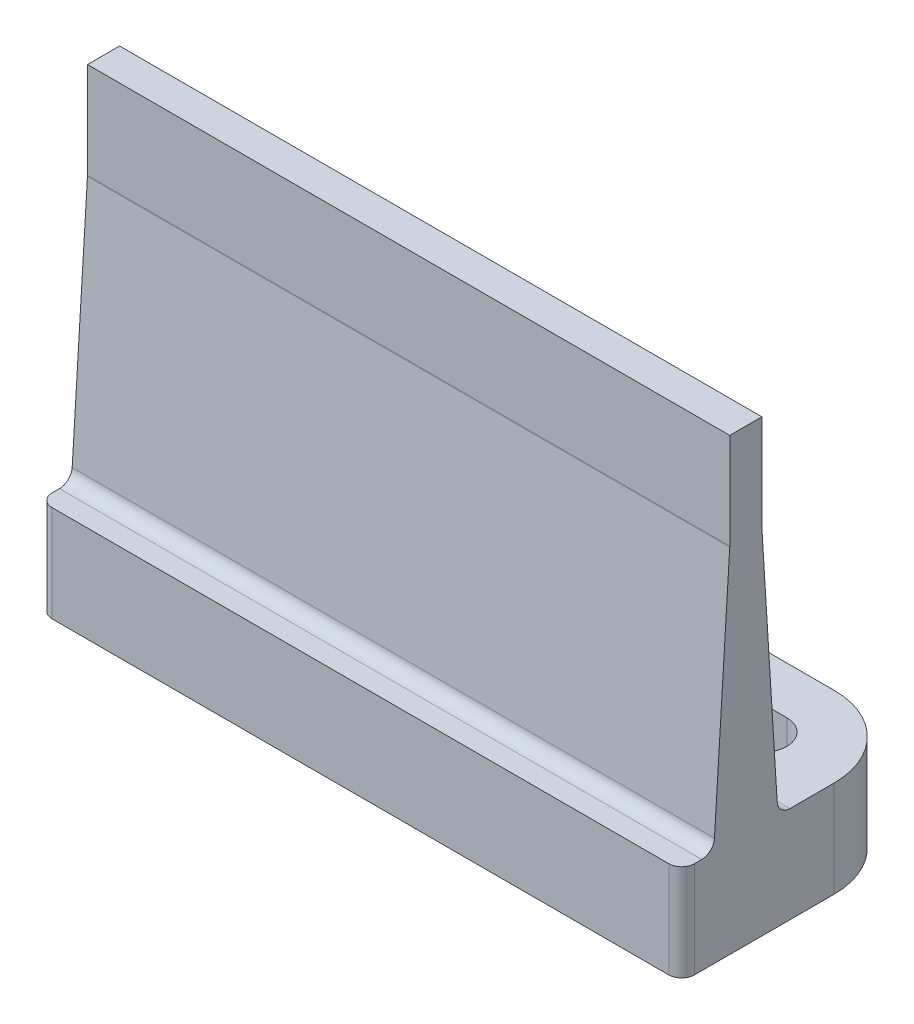
ISO-10303-21;
HEADER;
FILE_DESCRIPTION(('STEP AP214'),'2;1');
FILE_NAME('part.step','',(''),(''),'','','');
FILE_SCHEMA(('AUTOMOTIVE_DESIGN { 1 0 10303 214 1 1 1 1 }'));
ENDSEC;
DATA;
#1=APPLICATION_CONTEXT('core data for automotive mechanical design processes');
#2=APPLICATION_PROTOCOL_DEFINITION('international standard','automotive_design',2000,#1);
#3=PRODUCT_CONTEXT('',#1,'mechanical');
#4=PRODUCT('Part','Part','',(#3));
#5=PRODUCT_RELATED_PRODUCT_CATEGORY('part','',(#4));
#6=PRODUCT_DEFINITION_FORMATION('','',#4);
#7=PRODUCT_DEFINITION_CONTEXT('part definition',#1,'design');
#8=PRODUCT_DEFINITION('design','',#6,#7);
#9=PRODUCT_DEFINITION_SHAPE('','',#8);
#10=(LENGTH_UNIT() NAMED_UNIT(*) SI_UNIT(.MILLI.,.METRE.));
#11=(NAMED_UNIT(*) PLANE_ANGLE_UNIT() SI_UNIT($,.RADIAN.));
#12=(NAMED_UNIT(*) SI_UNIT($,.STERADIAN.) SOLID_ANGLE_UNIT());
#13=UNCERTAINTY_MEASURE_WITH_UNIT(LENGTH_MEASURE(1.E-05),#10,'distance_accuracy_value','');
#14=(GEOMETRIC_REPRESENTATION_CONTEXT(3) GLOBAL_UNCERTAINTY_ASSIGNED_CONTEXT((#13)) GLOBAL_UNIT_ASSIGNED_CONTEXT((#10,
#11,#12)) REPRESENTATION_CONTEXT('',''));
#15=CARTESIAN_POINT('',(0.,0.,0.));
#16=DIRECTION('',(0.,0.,1.));
#17=DIRECTION('',(1.,0.,0.));
#18=AXIS2_PLACEMENT_3D('',#15,#16,#17);
#19=CARTESIAN_POINT('',(20.,6.,4.));
#20=DIRECTION('',(0.,0.,-1.));
#21=DIRECTION('',(0.,1.,0.));
#22=AXIS2_PLACEMENT_3D('',#19,#20,#21);
#23=PLANE('',#22);
#24=DIRECTION('',(-1.,0.,0.));
#25=VECTOR('',#24,1.);
#26=CARTESIAN_POINT('',(20.,0.,4.));
#27=LINE('',#26,#25);
#28=CARTESIAN_POINT('',(19.20625,0.,4.));
#29=VERTEX_POINT('',#28);
#30=CARTESIAN_POINT('',(-19.20625,0.,4.));
#31=VERTEX_POINT('',#30);
#32=EDGE_CURVE('E443',#29,#31,#27,.T.);
#33=ORIENTED_EDGE('',*,*,#32,.F.);
#34=DIRECTION('',(0.,-1.,0.));
#35=VECTOR('',#34,1.);
#36=CARTESIAN_POINT('',(19.20625,6.,4.));
#37=LINE('',#36,#35);
#38=CARTESIAN_POINT('',(19.20625,6.,4.));
#39=VERTEX_POINT('',#38);
#40=EDGE_CURVE('E519',#29,#39,#37,.F.);
#41=ORIENTED_EDGE('',*,*,#40,.T.);
#42=DIRECTION('',(-1.,0.,0.));
#43=VECTOR('',#42,1.);
#44=CARTESIAN_POINT('',(20.,6.,4.));
#45=LINE('',#44,#43);
#46=CARTESIAN_POINT('',(-19.20625,6.,4.));
#47=VERTEX_POINT('',#46);
#48=EDGE_CURVE('E396',#39,#47,#45,.T.);
#49=ORIENTED_EDGE('',*,*,#48,.T.);
#50=DIRECTION('',(0.,-1.,0.));
#51=VECTOR('',#50,1.);
#52=CARTESIAN_POINT('',(-19.20625,6.,4.));
#53=LINE('',#52,#51);
#54=EDGE_CURVE('E516',#47,#31,#53,.T.);
#55=ORIENTED_EDGE('',*,*,#54,.T.);
#56=EDGE_LOOP('',(#33,#41,#49,#55));
#57=FACE_BOUND('',#56,.T.);
#58=ADVANCED_FACE('F42',(#57),#23,.F.);
#59=CARTESIAN_POINT('',(20.,0.,4.));
#60=DIRECTION('',(0.,1.,0.));
#61=DIRECTION('',(0.,0.,1.));
#62=AXIS2_PLACEMENT_3D('',#59,#60,#61);
#63=PLANE('',#62);
#64=DIRECTION('',(1.,0.,0.));
#65=VECTOR('',#64,1.);
#66=CARTESIAN_POINT('',(-15.,0.,-7.55));
#67=LINE('',#66,#65);
#68=CARTESIAN_POINT('',(-15.,0.,-7.55));
#69=VERTEX_POINT('',#68);
#70=CARTESIAN_POINT('',(-5.,0.,-7.55));
#71=VERTEX_POINT('',#70);
#72=EDGE_CURVE('E295',#69,#71,#67,.T.);
#73=ORIENTED_EDGE('',*,*,#72,.F.);
#74=CARTESIAN_POINT('',(-15.,0.,-6.));
#75=DIRECTION('',(0.,1.,0.));
#76=DIRECTION('',(0.,0.,1.));
#77=AXIS2_PLACEMENT_3D('',#74,#75,#76);
#78=CIRCLE('',#77,1.55);
#79=CARTESIAN_POINT('',(-15.,0.,-4.45));
#80=VERTEX_POINT('',#79);
#81=EDGE_CURVE('E271',#80,#69,#78,.F.);
#82=ORIENTED_EDGE('',*,*,#81,.F.);
#83=DIRECTION('',(-1.,0.,0.));
#84=VECTOR('',#83,1.);
#85=CARTESIAN_POINT('',(-15.,0.,-4.45));
#86=LINE('',#85,#84);
#87=CARTESIAN_POINT('',(-5.,0.,-4.45));
#88=VERTEX_POINT('',#87);
#89=EDGE_CURVE('E284',#88,#80,#86,.T.);
#90=ORIENTED_EDGE('',*,*,#89,.F.);
#91=CARTESIAN_POINT('',(-5.,0.,-6.));
#92=DIRECTION('',(0.,1.,0.));
#93=DIRECTION('',(0.,0.,1.));
#94=AXIS2_PLACEMENT_3D('',#91,#92,#93);
#95=CIRCLE('',#94,1.55);
#96=EDGE_CURVE('E303',#71,#88,#95,.F.);
#97=ORIENTED_EDGE('',*,*,#96,.F.);
#98=EDGE_LOOP('',(#73,#82,#90,#97));
#99=FACE_BOUND('',#98,.T.);
#100=DIRECTION('',(1.,0.,0.));
#101=VECTOR('',#100,1.);
#102=CARTESIAN_POINT('',(5.,0.,-7.55));
#103=LINE('',#102,#101);
#104=CARTESIAN_POINT('',(5.,0.,-7.55));
#105=VERTEX_POINT('',#104);
#106=CARTESIAN_POINT('',(15.,0.,-7.55));
#107=VERTEX_POINT('',#106);
#108=EDGE_CURVE('E326',#105,#107,#103,.T.);
#109=ORIENTED_EDGE('',*,*,#108,.F.);
#110=CARTESIAN_POINT('',(5.,0.,-6.));
#111=DIRECTION('',(0.,1.,0.));
#112=DIRECTION('',(0.,0.,1.));
#113=AXIS2_PLACEMENT_3D('',#110,#111,#112);
#114=CIRCLE('',#113,1.55);
#115=CARTESIAN_POINT('',(5.,0.,-4.45));
#116=VERTEX_POINT('',#115);
#117=EDGE_CURVE('E330',#116,#105,#114,.F.);
#118=ORIENTED_EDGE('',*,*,#117,.F.);
#119=DIRECTION('',(-1.,0.,0.));
#120=VECTOR('',#119,1.);
#121=CARTESIAN_POINT('',(5.,0.,-4.45));
#122=LINE('',#121,#120);
#123=CARTESIAN_POINT('',(15.,0.,-4.45));
#124=VERTEX_POINT('',#123);
#125=EDGE_CURVE('E353',#124,#116,#122,.T.);
#126=ORIENTED_EDGE('',*,*,#125,.F.);
#127=CARTESIAN_POINT('',(15.,0.,-6.));
#128=DIRECTION('',(0.,1.,0.));
#129=DIRECTION('',(0.,0.,1.));
#130=AXIS2_PLACEMENT_3D('',#127,#128,#129);
#131=CIRCLE('',#130,1.55);
#132=EDGE_CURVE('E323',#107,#124,#131,.F.);
#133=ORIENTED_EDGE('',*,*,#132,.F.);
#134=EDGE_LOOP('',(#109,#118,#126,#133));
#135=FACE_BOUND('',#134,.T.);
#136=DIRECTION('',(0.,0.,-1.));
#137=VECTOR('',#136,1.);
#138=CARTESIAN_POINT('',(20.,0.,4.));
#139=LINE('',#138,#137);
#140=CARTESIAN_POINT('',(20.,0.,3.20625));
#141=VERTEX_POINT('',#140);
#142=CARTESIAN_POINT('',(20.,0.,-5.5));
#143=VERTEX_POINT('',#142);
#144=EDGE_CURVE('E366',#141,#143,#139,.T.);
#145=ORIENTED_EDGE('',*,*,#144,.F.);
#146=CARTESIAN_POINT('',(19.20625,0.,3.20625));
#147=DIRECTION('',(0.,1.,0.));
#148=DIRECTION('',(0.,0.,1.));
#149=AXIS2_PLACEMENT_3D('',#146,#147,#148);
#150=CIRCLE('',#149,0.79375);
#151=EDGE_CURVE('E513',#141,#29,#150,.F.);
#152=ORIENTED_EDGE('',*,*,#151,.T.);
#153=ORIENTED_EDGE('',*,*,#32,.T.);
#154=CARTESIAN_POINT('',(-19.20625,0.,3.20625));
#155=DIRECTION('',(0.,1.,0.));
#156=DIRECTION('',(0.,0.,1.));
#157=AXIS2_PLACEMENT_3D('',#154,#155,#156);
#158=CIRCLE('',#157,0.79375);
#159=CARTESIAN_POINT('',(-20.,0.,3.20625));
#160=VERTEX_POINT('',#159);
#161=EDGE_CURVE('E61',#31,#160,#158,.F.);
#162=ORIENTED_EDGE('',*,*,#161,.T.);
#163=DIRECTION('',(0.,0.,-1.));
#164=VECTOR('',#163,1.);
#165=CARTESIAN_POINT('',(-20.,0.,4.));
#166=LINE('',#165,#164);
#167=CARTESIAN_POINT('',(-20.,0.,-5.5));
#168=VERTEX_POINT('',#167);
#169=EDGE_CURVE('E289',#160,#168,#166,.T.);
#170=ORIENTED_EDGE('',*,*,#169,.T.);
#171=CARTESIAN_POINT('',(-15.,0.,-5.5));
#172=DIRECTION('',(0.,1.,0.));
#173=DIRECTION('',(0.,0.,1.));
#174=AXIS2_PLACEMENT_3D('',#171,#172,#173);
#175=CIRCLE('',#174,5.);
#176=CARTESIAN_POINT('',(-15.,0.,-10.5));
#177=VERTEX_POINT('',#176);
#178=EDGE_CURVE('E463',#168,#177,#175,.F.);
#179=ORIENTED_EDGE('',*,*,#178,.T.);
#180=DIRECTION('',(-1.,0.,0.));
#181=VECTOR('',#180,1.);
#182=CARTESIAN_POINT('',(20.,0.,-10.5));
#183=LINE('',#182,#181);
#184=CARTESIAN_POINT('',(15.,0.,-10.5));
#185=VERTEX_POINT('',#184);
#186=EDGE_CURVE('E439',#185,#177,#183,.T.);
#187=ORIENTED_EDGE('',*,*,#186,.F.);
#188=CARTESIAN_POINT('',(15.,0.,-5.5));
#189=DIRECTION('',(0.,1.,0.));
#190=DIRECTION('',(0.,0.,1.));
#191=AXIS2_PLACEMENT_3D('',#188,#189,#190);
#192=CIRCLE('',#191,5.);
#193=EDGE_CURVE('E465',#185,#143,#192,.F.);
#194=ORIENTED_EDGE('',*,*,#193,.T.);
#195=EDGE_LOOP('',(#145,#152,#153,#162,#170,#179,#187,#194));
#196=FACE_BOUND('',#195,.T.);
#197=ADVANCED_FACE('F292',(#99,#135,#196),#63,.F.);
#198=CARTESIAN_POINT('',(20.,0.,-10.5));
#199=DIRECTION('',(0.,0.,1.));
#200=DIRECTION('',(1.,0.,0.));
#201=AXIS2_PLACEMENT_3D('',#198,#199,#200);
#202=PLANE('',#201);
#203=DIRECTION('',(-1.,0.,0.));
#204=VECTOR('',#203,1.);
#205=CARTESIAN_POINT('',(20.,6.,-10.5));
#206=LINE('',#205,#204);
#207=CARTESIAN_POINT('',(15.,6.,-10.5));
#208=VERTEX_POINT('',#207);
#209=CARTESIAN_POINT('',(-15.,6.,-10.5));
#210=VERTEX_POINT('',#209);
#211=EDGE_CURVE('E435',#208,#210,#206,.T.);
#212=ORIENTED_EDGE('',*,*,#211,.F.);
#213=DIRECTION('',(0.,1.,0.));
#214=VECTOR('',#213,1.);
#215=CARTESIAN_POINT('',(15.,0.,-10.5));
#216=LINE('',#215,#214);
#217=EDGE_CURVE('E460',#208,#185,#216,.F.);
#218=ORIENTED_EDGE('',*,*,#217,.T.);
#219=ORIENTED_EDGE('',*,*,#186,.T.);
#220=DIRECTION('',(0.,1.,0.));
#221=VECTOR('',#220,1.);
#222=CARTESIAN_POINT('',(-15.,0.,-10.5));
#223=LINE('',#222,#221);
#224=EDGE_CURVE('E456',#177,#210,#223,.T.);
#225=ORIENTED_EDGE('',*,*,#224,.T.);
#226=EDGE_LOOP('',(#212,#218,#219,#225));
#227=FACE_BOUND('',#226,.T.);
#228=ADVANCED_FACE('F626',(#227),#202,.F.);
#229=CARTESIAN_POINT('',(20.,6.,-10.5));
#230=DIRECTION('',(0.,-1.,0.));
#231=DIRECTION('',(0.,0.,-1.));
#232=AXIS2_PLACEMENT_3D('',#229,#230,#231);
#233=PLANE('',#232);
#234=DIRECTION('',(1.,0.,0.));
#235=VECTOR('',#234,1.);
#236=CARTESIAN_POINT('',(-15.,6.,-4.45));
#237=LINE('',#236,#235);
#238=CARTESIAN_POINT('',(-15.,6.,-4.45));
#239=VERTEX_POINT('',#238);
#240=CARTESIAN_POINT('',(-5.,6.,-4.45));
#241=VERTEX_POINT('',#240);
#242=EDGE_CURVE('E300',#239,#241,#237,.T.);
#243=ORIENTED_EDGE('',*,*,#242,.F.);
#244=CARTESIAN_POINT('',(-15.,6.,-6.));
#245=DIRECTION('',(0.,1.,0.));
#246=DIRECTION('',(0.,0.,1.));
#247=AXIS2_PLACEMENT_3D('',#244,#245,#246);
#248=CIRCLE('',#247,1.55);
#249=CARTESIAN_POINT('',(-15.,6.,-7.55));
#250=VERTEX_POINT('',#249);
#251=EDGE_CURVE('E274',#250,#239,#248,.T.);
#252=ORIENTED_EDGE('',*,*,#251,.F.);
#253=DIRECTION('',(-1.,0.,0.));
#254=VECTOR('',#253,1.);
#255=CARTESIAN_POINT('',(-15.,6.,-7.55));
#256=LINE('',#255,#254);
#257=CARTESIAN_POINT('',(-5.,6.,-7.55));
#258=VERTEX_POINT('',#257);
#259=EDGE_CURVE('E280',#258,#250,#256,.T.);
#260=ORIENTED_EDGE('',*,*,#259,.F.);
#261=CARTESIAN_POINT('',(-5.,6.,-6.));
#262=DIRECTION('',(0.,1.,0.));
#263=DIRECTION('',(0.,0.,1.));
#264=AXIS2_PLACEMENT_3D('',#261,#262,#263);
#265=CIRCLE('',#264,1.55);
#266=EDGE_CURVE('E309',#241,#258,#265,.T.);
#267=ORIENTED_EDGE('',*,*,#266,.F.);
#268=EDGE_LOOP('',(#243,#252,#260,#267));
#269=FACE_BOUND('',#268,.T.);
#270=DIRECTION('',(1.,0.,0.));
#271=VECTOR('',#270,1.);
#272=CARTESIAN_POINT('',(5.,6.,-4.45));
#273=LINE('',#272,#271);
#274=CARTESIAN_POINT('',(5.,6.,-4.45));
#275=VERTEX_POINT('',#274);
#276=CARTESIAN_POINT('',(15.,6.,-4.45));
#277=VERTEX_POINT('',#276);
#278=EDGE_CURVE('E337',#275,#277,#273,.T.);
#279=ORIENTED_EDGE('',*,*,#278,.F.);
#280=CARTESIAN_POINT('',(5.,6.,-6.));
#281=DIRECTION('',(0.,1.,0.));
#282=DIRECTION('',(0.,0.,1.));
#283=AXIS2_PLACEMENT_3D('',#280,#281,#282);
#284=CIRCLE('',#283,1.55);
#285=CARTESIAN_POINT('',(5.,6.,-7.55));
#286=VERTEX_POINT('',#285);
#287=EDGE_CURVE('E334',#286,#275,#284,.T.);
#288=ORIENTED_EDGE('',*,*,#287,.F.);
#289=DIRECTION('',(-1.,0.,0.));
#290=VECTOR('',#289,1.);
#291=CARTESIAN_POINT('',(5.,6.,-7.55));
#292=LINE('',#291,#290);
#293=CARTESIAN_POINT('',(15.,6.,-7.55));
#294=VERTEX_POINT('',#293);
#295=EDGE_CURVE('E345',#294,#286,#292,.T.);
#296=ORIENTED_EDGE('',*,*,#295,.F.);
#297=CARTESIAN_POINT('',(15.,6.,-6.));
#298=DIRECTION('',(0.,1.,0.));
#299=DIRECTION('',(0.,0.,1.));
#300=AXIS2_PLACEMENT_3D('',#297,#298,#299);
#301=CIRCLE('',#300,1.55);
#302=EDGE_CURVE('E341',#277,#294,#301,.T.);
#303=ORIENTED_EDGE('',*,*,#302,.F.);
#304=EDGE_LOOP('',(#279,#288,#296,#303));
#305=FACE_BOUND('',#304,.T.);
#306=DIRECTION('',(0.,0.,1.));
#307=VECTOR('',#306,1.);
#308=CARTESIAN_POINT('',(-20.,6.,-10.5));
#309=LINE('',#308,#307);
#310=CARTESIAN_POINT('',(-20.,6.,-5.5));
#311=VERTEX_POINT('',#310);
#312=CARTESIAN_POINT('',(-20.,6.,-2.74568940696052));
#313=VERTEX_POINT('',#312);
#314=EDGE_CURVE('E399',#311,#313,#309,.T.);
#315=ORIENTED_EDGE('',*,*,#314,.T.);
#316=DIRECTION('',(-1.,0.,0.));
#317=VECTOR('',#316,1.);
#318=CARTESIAN_POINT('',(20.,6.,-2.74568940696052));
#319=LINE('',#318,#317);
#320=CARTESIAN_POINT('',(20.,6.,-2.74568940696052));
#321=VERTEX_POINT('',#320);
#322=EDGE_CURVE('E480',#313,#321,#319,.F.);
#323=ORIENTED_EDGE('',*,*,#322,.T.);
#324=DIRECTION('',(0.,0.,1.));
#325=VECTOR('',#324,1.);
#326=CARTESIAN_POINT('',(20.,6.,-10.5));
#327=LINE('',#326,#325);
#328=CARTESIAN_POINT('',(20.,6.,-5.5));
#329=VERTEX_POINT('',#328);
#330=EDGE_CURVE('E369',#329,#321,#327,.T.);
#331=ORIENTED_EDGE('',*,*,#330,.F.);
#332=CARTESIAN_POINT('',(15.,6.,-5.5));
#333=DIRECTION('',(0.,-1.,0.));
#334=DIRECTION('',(0.,0.,-1.));
#335=AXIS2_PLACEMENT_3D('',#332,#333,#334);
#336=CIRCLE('',#335,5.);
#337=EDGE_CURVE('E453',#329,#208,#336,.F.);
#338=ORIENTED_EDGE('',*,*,#337,.T.);
#339=ORIENTED_EDGE('',*,*,#211,.T.);
#340=CARTESIAN_POINT('',(-15.,6.,-5.5));
#341=DIRECTION('',(0.,-1.,0.));
#342=DIRECTION('',(0.,0.,-1.));
#343=AXIS2_PLACEMENT_3D('',#340,#341,#342);
#344=CIRCLE('',#343,5.);
#345=EDGE_CURVE('E450',#210,#311,#344,.F.);
#346=ORIENTED_EDGE('',*,*,#345,.T.);
#347=EDGE_LOOP('',(#315,#323,#331,#338,#339,#346));
#348=FACE_BOUND('',#347,.T.);
#349=ADVANCED_FACE('F578',(#269,#305,#348),#233,.F.);
#350=CARTESIAN_POINT('',(20.,6.,-2.));
#351=DIRECTION('',(0.,-0.0623782861551806,0.998052578482889));
#352=DIRECTION('',(0.,-0.998052578482889,-0.0623782861551806));
#353=AXIS2_PLACEMENT_3D('',#350,#351,#352);
#354=PLANE('',#353);
#355=DIRECTION('',(0.,0.998052578482889,0.0623782861551806));
#356=VECTOR('',#355,1.);
#357=CARTESIAN_POINT('',(20.,6.,-2.));
#358=LINE('',#357,#356);
#359=CARTESIAN_POINT('',(20.,6.74423723536432,-1.95348517278973));
#360=VERTEX_POINT('',#359);
#361=CARTESIAN_POINT('',(20.,21.9752677467327,-1.00154576582921));
#362=VERTEX_POINT('',#361);
#363=EDGE_CURVE('E374',#360,#362,#358,.T.);
#364=ORIENTED_EDGE('',*,*,#363,.F.);
#365=DIRECTION('',(-1.,0.,0.));
#366=VECTOR('',#365,1.);
#367=CARTESIAN_POINT('',(-20.,6.74423723536432,-1.95348517278973));
#368=LINE('',#367,#366);
#369=CARTESIAN_POINT('',(-20.,6.74423723536432,-1.95348517278973));
#370=VERTEX_POINT('',#369);
#371=EDGE_CURVE('E476',#360,#370,#368,.T.);
#372=ORIENTED_EDGE('',*,*,#371,.T.);
#373=DIRECTION('',(0.,0.998052578482889,0.0623782861551806));
#374=VECTOR('',#373,1.);
#375=CARTESIAN_POINT('',(-20.,6.,-2.));
#376=LINE('',#375,#374);
#377=CARTESIAN_POINT('',(-20.,21.9752677467327,-1.00154576582921));
#378=VERTEX_POINT('',#377);
#379=EDGE_CURVE('E403',#370,#378,#376,.T.);
#380=ORIENTED_EDGE('',*,*,#379,.T.);
#381=DIRECTION('',(-1.,0.,0.));
#382=VECTOR('',#381,1.);
#383=CARTESIAN_POINT('',(20.,21.9752677467327,-1.00154576582921));
#384=LINE('',#383,#382);
#385=EDGE_CURVE('E473',#378,#362,#384,.F.);
#386=ORIENTED_EDGE('',*,*,#385,.T.);
#387=EDGE_LOOP('',(#364,#372,#380,#386));
#388=FACE_BOUND('',#387,.T.);
#389=ADVANCED_FACE('F588',(#388),#354,.F.);
#390=CARTESIAN_POINT('',(20.,22.,-0.999999999999999));
#391=DIRECTION('',(0.,0.,1.));
#392=DIRECTION('',(0.,-1.,0.));
#393=AXIS2_PLACEMENT_3D('',#390,#391,#392);
#394=PLANE('',#393);
#395=DIRECTION('',(0.,1.,0.));
#396=VECTOR('',#395,1.);
#397=CARTESIAN_POINT('',(20.,22.,-0.999999999999999));
#398=LINE('',#397,#396);
#399=CARTESIAN_POINT('',(20.,22.0247805113684,-0.999999999999999));
#400=VERTEX_POINT('',#399);
#401=CARTESIAN_POINT('',(20.,28.,-1.));
#402=VERTEX_POINT('',#401);
#403=EDGE_CURVE('E378',#400,#402,#398,.T.);
#404=ORIENTED_EDGE('',*,*,#403,.F.);
#405=DIRECTION('',(-1.,0.,0.));
#406=VECTOR('',#405,1.);
#407=CARTESIAN_POINT('',(-20.,22.0247805113684,-0.999999999999999));
#408=LINE('',#407,#406);
#409=CARTESIAN_POINT('',(-20.,22.0247805113684,-0.999999999999999));
#410=VERTEX_POINT('',#409);
#411=EDGE_CURVE('E483',#400,#410,#408,.T.);
#412=ORIENTED_EDGE('',*,*,#411,.T.);
#413=DIRECTION('',(0.,1.,0.));
#414=VECTOR('',#413,1.);
#415=CARTESIAN_POINT('',(-20.,22.,-0.999999999999999));
#416=LINE('',#415,#414);
#417=CARTESIAN_POINT('',(-20.,28.,-1.));
#418=VERTEX_POINT('',#417);
#419=EDGE_CURVE('E407',#410,#418,#416,.T.);
#420=ORIENTED_EDGE('',*,*,#419,.T.);
#421=DIRECTION('',(-1.,0.,0.));
#422=VECTOR('',#421,1.);
#423=CARTESIAN_POINT('',(20.,28.,-1.));
#424=LINE('',#423,#422);
#425=EDGE_CURVE('E431',#402,#418,#424,.T.);
#426=ORIENTED_EDGE('',*,*,#425,.F.);
#427=EDGE_LOOP('',(#404,#412,#420,#426));
#428=FACE_BOUND('',#427,.T.);
#429=ADVANCED_FACE('F597',(#428),#394,.F.);
#430=CARTESIAN_POINT('',(20.,28.,-1.));
#431=DIRECTION('',(0.,-1.,0.));
#432=DIRECTION('',(0.,0.,-1.));
#433=AXIS2_PLACEMENT_3D('',#430,#431,#432);
#434=PLANE('',#433);
#435=DIRECTION('',(0.,0.,1.));
#436=VECTOR('',#435,1.);
#437=CARTESIAN_POINT('',(-20.,28.,-1.));
#438=LINE('',#437,#436);
#439=CARTESIAN_POINT('',(-20.,28.,1.));
#440=VERTEX_POINT('',#439);
#441=EDGE_CURVE('E410',#418,#440,#438,.T.);
#442=ORIENTED_EDGE('',*,*,#441,.T.);
#443=DIRECTION('',(-1.,0.,0.));
#444=VECTOR('',#443,1.);
#445=CARTESIAN_POINT('',(20.,28.,1.));
#446=LINE('',#445,#444);
#447=CARTESIAN_POINT('',(20.,28.,1.));
#448=VERTEX_POINT('',#447);
#449=EDGE_CURVE('E427',#448,#440,#446,.T.);
#450=ORIENTED_EDGE('',*,*,#449,.F.);
#451=DIRECTION('',(0.,0.,1.));
#452=VECTOR('',#451,1.);
#453=CARTESIAN_POINT('',(20.,28.,-1.));
#454=LINE('',#453,#452);
#455=EDGE_CURVE('E381',#402,#448,#454,.T.);
#456=ORIENTED_EDGE('',*,*,#455,.F.);
#457=ORIENTED_EDGE('',*,*,#425,.T.);
#458=EDGE_LOOP('',(#442,#450,#456,#457));
#459=FACE_BOUND('',#458,.T.);
#460=ADVANCED_FACE('F603',(#459),#434,.F.);
#461=CARTESIAN_POINT('',(20.,28.,1.));
#462=DIRECTION('',(0.,0.,-1.));
#463=DIRECTION('',(0.,1.,0.));
#464=AXIS2_PLACEMENT_3D('',#461,#462,#463);
#465=PLANE('',#464);
#466=DIRECTION('',(0.,-1.,0.));
#467=VECTOR('',#466,1.);
#468=CARTESIAN_POINT('',(-20.,28.,1.));
#469=LINE('',#468,#467);
#470=CARTESIAN_POINT('',(-20.,22.0247805113684,0.999999999999999));
#471=VERTEX_POINT('',#470);
#472=EDGE_CURVE('E413',#440,#471,#469,.T.);
#473=ORIENTED_EDGE('',*,*,#472,.T.);
#474=DIRECTION('',(-1.,0.,0.));
#475=VECTOR('',#474,1.);
#476=CARTESIAN_POINT('',(20.,22.0247805113684,0.999999999999999));
#477=LINE('',#476,#475);
#478=CARTESIAN_POINT('',(20.,22.0247805113684,0.999999999999999));
#479=VERTEX_POINT('',#478);
#480=EDGE_CURVE('E494',#471,#479,#477,.F.);
#481=ORIENTED_EDGE('',*,*,#480,.T.);
#482=DIRECTION('',(0.,-1.,0.));
#483=VECTOR('',#482,1.);
#484=CARTESIAN_POINT('',(20.,28.,1.));
#485=LINE('',#484,#483);
#486=EDGE_CURVE('E384',#448,#479,#485,.T.);
#487=ORIENTED_EDGE('',*,*,#486,.F.);
#488=ORIENTED_EDGE('',*,*,#449,.T.);
#489=EDGE_LOOP('',(#473,#481,#487,#488));
#490=FACE_BOUND('',#489,.T.);
#491=ADVANCED_FACE('F611',(#490),#465,.F.);
#492=CARTESIAN_POINT('',(20.,22.,0.999999999999999));
#493=DIRECTION('',(0.,-0.0623782861551806,-0.998052578482889));
#494=DIRECTION('',(0.,0.998052578482889,-0.0623782861551806));
#495=AXIS2_PLACEMENT_3D('',#492,#493,#494);
#496=PLANE('',#495);
#497=DIRECTION('',(0.,-0.998052578482889,0.0623782861551806));
#498=VECTOR('',#497,1.);
#499=CARTESIAN_POINT('',(20.,22.,0.999999999999999));
#500=LINE('',#499,#498);
#501=CARTESIAN_POINT('',(20.,21.9752677467327,1.00154576582921));
#502=VERTEX_POINT('',#501);
#503=CARTESIAN_POINT('',(20.,6.74423723536432,1.95348517278973));
#504=VERTEX_POINT('',#503);
#505=EDGE_CURVE('E388',#502,#504,#500,.T.);
#506=ORIENTED_EDGE('',*,*,#505,.F.);
#507=DIRECTION('',(-1.,0.,0.));
#508=VECTOR('',#507,1.);
#509=CARTESIAN_POINT('',(-20.,21.9752677467327,1.00154576582921));
#510=LINE('',#509,#508);
#511=CARTESIAN_POINT('',(-20.,21.9752677467327,1.00154576582921));
#512=VERTEX_POINT('',#511);
#513=EDGE_CURVE('E490',#502,#512,#510,.T.);
#514=ORIENTED_EDGE('',*,*,#513,.T.);
#515=DIRECTION('',(0.,-0.998052578482889,0.0623782861551806));
#516=VECTOR('',#515,1.);
#517=CARTESIAN_POINT('',(-20.,22.,0.999999999999999));
#518=LINE('',#517,#516);
#519=CARTESIAN_POINT('',(-20.,6.74423723536432,1.95348517278973));
#520=VERTEX_POINT('',#519);
#521=EDGE_CURVE('E417',#512,#520,#518,.T.);
#522=ORIENTED_EDGE('',*,*,#521,.T.);
#523=DIRECTION('',(-1.,0.,0.));
#524=VECTOR('',#523,1.);
#525=CARTESIAN_POINT('',(20.,6.74423723536432,1.95348517278973));
#526=LINE('',#525,#524);
#527=EDGE_CURVE('E487',#520,#504,#526,.F.);
#528=ORIENTED_EDGE('',*,*,#527,.T.);
#529=EDGE_LOOP('',(#506,#514,#522,#528));
#530=FACE_BOUND('',#529,.T.);
#531=ADVANCED_FACE('F552',(#530),#496,.F.);
#532=CARTESIAN_POINT('',(20.,6.,2.));
#533=DIRECTION('',(0.,-1.,0.));
#534=DIRECTION('',(0.,0.,-1.));
#535=AXIS2_PLACEMENT_3D('',#532,#533,#534);
#536=PLANE('',#535);
#537=DIRECTION('',(0.,0.,1.));
#538=VECTOR('',#537,1.);
#539=CARTESIAN_POINT('',(20.,6.,2.));
#540=LINE('',#539,#538);
#541=CARTESIAN_POINT('',(20.,6.,2.74568940696052));
#542=VERTEX_POINT('',#541);
#543=CARTESIAN_POINT('',(20.,6.,3.20625));
#544=VERTEX_POINT('',#543);
#545=EDGE_CURVE('E392',#542,#544,#540,.T.);
#546=ORIENTED_EDGE('',*,*,#545,.F.);
#547=DIRECTION('',(-1.,0.,0.));
#548=VECTOR('',#547,1.);
#549=CARTESIAN_POINT('',(-20.,6.,2.74568940696052));
#550=LINE('',#549,#548);
#551=CARTESIAN_POINT('',(-20.,6.,2.74568940696052));
#552=VERTEX_POINT('',#551);
#553=EDGE_CURVE('E503',#542,#552,#550,.T.);
#554=ORIENTED_EDGE('',*,*,#553,.T.);
#555=DIRECTION('',(0.,0.,1.));
#556=VECTOR('',#555,1.);
#557=CARTESIAN_POINT('',(-20.,6.,2.));
#558=LINE('',#557,#556);
#559=CARTESIAN_POINT('',(-20.,6.,3.20625));
#560=VERTEX_POINT('',#559);
#561=EDGE_CURVE('E370',#552,#560,#558,.T.);
#562=ORIENTED_EDGE('',*,*,#561,.T.);
#563=CARTESIAN_POINT('',(-19.20625,6.,3.20625));
#564=DIRECTION('',(0.,-1.,0.));
#565=DIRECTION('',(0.,0.,-1.));
#566=AXIS2_PLACEMENT_3D('',#563,#564,#565);
#567=CIRCLE('',#566,0.79375);
#568=EDGE_CURVE('E497',#560,#47,#567,.F.);
#569=ORIENTED_EDGE('',*,*,#568,.T.);
#570=ORIENTED_EDGE('',*,*,#48,.F.);
#571=CARTESIAN_POINT('',(19.20625,6.,3.20625));
#572=DIRECTION('',(0.,-1.,0.));
#573=DIRECTION('',(0.,0.,-1.));
#574=AXIS2_PLACEMENT_3D('',#571,#572,#573);
#575=CIRCLE('',#574,0.79375);
#576=EDGE_CURVE('E500',#39,#544,#575,.F.);
#577=ORIENTED_EDGE('',*,*,#576,.T.);
#578=EDGE_LOOP('',(#546,#554,#562,#569,#570,#577));
#579=FACE_BOUND('',#578,.T.);
#580=ADVANCED_FACE('F561',(#579),#536,.F.);
#581=CARTESIAN_POINT('',(20.,0.,0.));
#582=DIRECTION('',(1.,0.,0.));
#583=DIRECTION('',(0.,0.,-1.));
#584=AXIS2_PLACEMENT_3D('',#581,#582,#583);
#585=PLANE('',#584);
#586=ORIENTED_EDGE('',*,*,#545,.T.);
#587=DIRECTION('',(0.,-1.,0.));
#588=VECTOR('',#587,1.);
#589=CARTESIAN_POINT('',(20.,0.,3.20625));
#590=LINE('',#589,#588);
#591=EDGE_CURVE('E507',#544,#141,#590,.T.);
#592=ORIENTED_EDGE('',*,*,#591,.T.);
#593=ORIENTED_EDGE('',*,*,#144,.T.);
#594=DIRECTION('',(0.,1.,0.));
#595=VECTOR('',#594,1.);
#596=CARTESIAN_POINT('',(20.,6.,-5.5));
#597=LINE('',#596,#595);
#598=EDGE_CURVE('E446',#143,#329,#597,.T.);
#599=ORIENTED_EDGE('',*,*,#598,.T.);
#600=ORIENTED_EDGE('',*,*,#330,.T.);
#601=CARTESIAN_POINT('',(20.,6.79375,-2.74568940696052));
#602=DIRECTION('',(1.,0.,0.));
#603=DIRECTION('',(0.,0.,-1.));
#604=AXIS2_PLACEMENT_3D('',#601,#602,#603);
#605=CIRCLE('',#604,0.79375);
#606=EDGE_CURVE('E528',#321,#360,#605,.F.);
#607=ORIENTED_EDGE('',*,*,#606,.T.);
#608=ORIENTED_EDGE('',*,*,#363,.T.);
#609=CARTESIAN_POINT('',(20.,22.0247805113684,-1.79375));
#610=DIRECTION('',(1.,0.,0.));
#611=DIRECTION('',(0.,0.,-1.));
#612=AXIS2_PLACEMENT_3D('',#609,#610,#611);
#613=CIRCLE('',#612,0.79375);
#614=EDGE_CURVE('E534',#362,#400,#613,.F.);
#615=ORIENTED_EDGE('',*,*,#614,.T.);
#616=ORIENTED_EDGE('',*,*,#403,.T.);
#617=ORIENTED_EDGE('',*,*,#455,.T.);
#618=ORIENTED_EDGE('',*,*,#486,.T.);
#619=CARTESIAN_POINT('',(20.,22.0247805113684,1.79375));
#620=DIRECTION('',(1.,0.,0.));
#621=DIRECTION('',(0.,0.,-1.));
#622=AXIS2_PLACEMENT_3D('',#619,#620,#621);
#623=CIRCLE('',#622,0.79375);
#624=EDGE_CURVE('E540',#479,#502,#623,.F.);
#625=ORIENTED_EDGE('',*,*,#624,.T.);
#626=ORIENTED_EDGE('',*,*,#505,.T.);
#627=CARTESIAN_POINT('',(20.,6.79375,2.74568940696052));
#628=DIRECTION('',(1.,0.,0.));
#629=DIRECTION('',(0.,0.,-1.));
#630=AXIS2_PLACEMENT_3D('',#627,#628,#629);
#631=CIRCLE('',#630,0.79375);
#632=EDGE_CURVE('E11',#504,#542,#631,.F.);
#633=ORIENTED_EDGE('',*,*,#632,.T.);
#634=EDGE_LOOP('',(#586,#592,#593,#599,#600,#607,#608,#615,#616,#617,#618,#625,#626,#633));
#635=FACE_BOUND('',#634,.T.);
#636=ADVANCED_FACE('F558',(#635),#585,.T.);
#637=CARTESIAN_POINT('',(-20.,0.,0.));
#638=DIRECTION('',(1.,0.,0.));
#639=DIRECTION('',(0.,0.,-1.));
#640=AXIS2_PLACEMENT_3D('',#637,#638,#639);
#641=PLANE('',#640);
#642=ORIENTED_EDGE('',*,*,#169,.F.);
#643=DIRECTION('',(0.,-1.,0.));
#644=VECTOR('',#643,1.);
#645=CARTESIAN_POINT('',(-20.,0.,3.20625));
#646=LINE('',#645,#644);
#647=EDGE_CURVE('E522',#160,#560,#646,.F.);
#648=ORIENTED_EDGE('',*,*,#647,.T.);
#649=ORIENTED_EDGE('',*,*,#561,.F.);
#650=CARTESIAN_POINT('',(-20.,6.79375,2.74568940696052));
#651=DIRECTION('',(1.,0.,0.));
#652=DIRECTION('',(0.,0.,-1.));
#653=AXIS2_PLACEMENT_3D('',#650,#651,#652);
#654=CIRCLE('',#653,0.79375);
#655=EDGE_CURVE('E51',#552,#520,#654,.T.);
#656=ORIENTED_EDGE('',*,*,#655,.T.);
#657=ORIENTED_EDGE('',*,*,#521,.F.);
#658=CARTESIAN_POINT('',(-20.,22.0247805113684,1.79375));
#659=DIRECTION('',(1.,0.,0.));
#660=DIRECTION('',(0.,0.,-1.));
#661=AXIS2_PLACEMENT_3D('',#658,#659,#660);
#662=CIRCLE('',#661,0.79375);
#663=EDGE_CURVE('E537',#512,#471,#662,.T.);
#664=ORIENTED_EDGE('',*,*,#663,.T.);
#665=ORIENTED_EDGE('',*,*,#472,.F.);
#666=ORIENTED_EDGE('',*,*,#441,.F.);
#667=ORIENTED_EDGE('',*,*,#419,.F.);
#668=CARTESIAN_POINT('',(-20.,22.0247805113684,-1.79375));
#669=DIRECTION('',(1.,0.,0.));
#670=DIRECTION('',(0.,0.,-1.));
#671=AXIS2_PLACEMENT_3D('',#668,#669,#670);
#672=CIRCLE('',#671,0.79375);
#673=EDGE_CURVE('E531',#410,#378,#672,.T.);
#674=ORIENTED_EDGE('',*,*,#673,.T.);
#675=ORIENTED_EDGE('',*,*,#379,.F.);
#676=CARTESIAN_POINT('',(-20.,6.79375,-2.74568940696052));
#677=DIRECTION('',(1.,0.,0.));
#678=DIRECTION('',(0.,0.,-1.));
#679=AXIS2_PLACEMENT_3D('',#676,#677,#678);
#680=CIRCLE('',#679,0.79375);
#681=EDGE_CURVE('E525',#370,#313,#680,.T.);
#682=ORIENTED_EDGE('',*,*,#681,.T.);
#683=ORIENTED_EDGE('',*,*,#314,.F.);
#684=DIRECTION('',(0.,1.,0.));
#685=VECTOR('',#684,1.);
#686=CARTESIAN_POINT('',(-20.,0.,-5.5));
#687=LINE('',#686,#685);
#688=EDGE_CURVE('E469',#311,#168,#687,.F.);
#689=ORIENTED_EDGE('',*,*,#688,.T.);
#690=EDGE_LOOP('',(#642,#648,#649,#656,#657,#664,#665,#666,#667,#674,#675,#682,#683,#689));
#691=FACE_BOUND('',#690,.T.);
#692=ADVANCED_FACE('F546',(#691),#641,.F.);
#693=CARTESIAN_POINT('',(5.,-0.001000000000001,-6.));
#694=DIRECTION('',(0.,1.,0.));
#695=DIRECTION('',(0.,0.,1.));
#696=AXIS2_PLACEMENT_3D('',#693,#694,#695);
#697=CYLINDRICAL_SURFACE('',#696,1.55);
#698=ORIENTED_EDGE('',*,*,#117,.T.);
#699=DIRECTION('',(0.,1.,0.));
#700=VECTOR('',#699,1.);
#701=CARTESIAN_POINT('',(5.,-0.001000000000001,-7.55));
#702=LINE('',#701,#700);
#703=EDGE_CURVE('E350',#105,#286,#702,.T.);
#704=ORIENTED_EDGE('',*,*,#703,.T.);
#705=ORIENTED_EDGE('',*,*,#287,.T.);
#706=DIRECTION('',(0.,1.,0.));
#707=VECTOR('',#706,1.);
#708=CARTESIAN_POINT('',(5.,-0.00100000000000187,-4.45));
#709=LINE('',#708,#707);
#710=EDGE_CURVE('E349',#116,#275,#709,.T.);
#711=ORIENTED_EDGE('',*,*,#710,.F.);
#712=EDGE_LOOP('',(#698,#704,#705,#711));
#713=FACE_BOUND('',#712,.T.);
#714=ADVANCED_FACE('F678',(#713),#697,.F.);
#715=CARTESIAN_POINT('',(5.,-0.001000000000001,-7.55));
#716=DIRECTION('',(0.,0.,-1.));
#717=DIRECTION('',(-1.,0.,0.));
#718=AXIS2_PLACEMENT_3D('',#715,#716,#717);
#719=PLANE('',#718);
#720=ORIENTED_EDGE('',*,*,#108,.T.);
#721=DIRECTION('',(0.,1.,0.));
#722=VECTOR('',#721,1.);
#723=CARTESIAN_POINT('',(15.,-0.001000000000001,-7.55));
#724=LINE('',#723,#722);
#725=EDGE_CURVE('E354',#107,#294,#724,.T.);
#726=ORIENTED_EDGE('',*,*,#725,.T.);
#727=ORIENTED_EDGE('',*,*,#295,.T.);
#728=ORIENTED_EDGE('',*,*,#703,.F.);
#729=EDGE_LOOP('',(#720,#726,#727,#728));
#730=FACE_BOUND('',#729,.T.);
#731=ADVANCED_FACE('F683',(#730),#719,.F.);
#732=CARTESIAN_POINT('',(15.,-0.001000000000001,-6.));
#733=DIRECTION('',(0.,1.,0.));
#734=DIRECTION('',(0.,0.,1.));
#735=AXIS2_PLACEMENT_3D('',#732,#733,#734);
#736=CYLINDRICAL_SURFACE('',#735,1.55);
#737=ORIENTED_EDGE('',*,*,#132,.T.);
#738=DIRECTION('',(0.,1.,0.));
#739=VECTOR('',#738,1.);
#740=CARTESIAN_POINT('',(15.,-0.001000000000001,-4.45));
#741=LINE('',#740,#739);
#742=EDGE_CURVE('E357',#124,#277,#741,.T.);
#743=ORIENTED_EDGE('',*,*,#742,.T.);
#744=ORIENTED_EDGE('',*,*,#302,.T.);
#745=ORIENTED_EDGE('',*,*,#725,.F.);
#746=EDGE_LOOP('',(#737,#743,#744,#745));
#747=FACE_BOUND('',#746,.T.);
#748=ADVANCED_FACE('F695',(#747),#736,.F.);
#749=CARTESIAN_POINT('',(5.,-0.00100000000000187,-4.45));
#750=DIRECTION('',(0.,0.,1.));
#751=DIRECTION('',(1.,0.,0.));
#752=AXIS2_PLACEMENT_3D('',#749,#750,#751);
#753=PLANE('',#752);
#754=ORIENTED_EDGE('',*,*,#125,.T.);
#755=ORIENTED_EDGE('',*,*,#710,.T.);
#756=ORIENTED_EDGE('',*,*,#278,.T.);
#757=ORIENTED_EDGE('',*,*,#742,.F.);
#758=EDGE_LOOP('',(#754,#755,#756,#757));
#759=FACE_BOUND('',#758,.T.);
#760=ADVANCED_FACE('F705',(#759),#753,.F.);
#761=CARTESIAN_POINT('',(-15.,-0.001000000000001,-6.));
#762=DIRECTION('',(0.,1.,0.));
#763=DIRECTION('',(0.,0.,1.));
#764=AXIS2_PLACEMENT_3D('',#761,#762,#763);
#765=CYLINDRICAL_SURFACE('',#764,1.55);
#766=ORIENTED_EDGE('',*,*,#81,.T.);
#767=DIRECTION('',(0.,1.,0.));
#768=VECTOR('',#767,1.);
#769=CARTESIAN_POINT('',(-15.,-0.001000000000001,-7.55));
#770=LINE('',#769,#768);
#771=EDGE_CURVE('E290',#69,#250,#770,.T.);
#772=ORIENTED_EDGE('',*,*,#771,.T.);
#773=ORIENTED_EDGE('',*,*,#251,.T.);
#774=DIRECTION('',(0.,1.,0.));
#775=VECTOR('',#774,1.);
#776=CARTESIAN_POINT('',(-15.,-0.00100000000000187,-4.45));
#777=LINE('',#776,#775);
#778=EDGE_CURVE('E267',#80,#239,#777,.T.);
#779=ORIENTED_EDGE('',*,*,#778,.F.);
#780=EDGE_LOOP('',(#766,#772,#773,#779));
#781=FACE_BOUND('',#780,.T.);
#782=ADVANCED_FACE('F269',(#781),#765,.F.);
#783=CARTESIAN_POINT('',(-15.,-0.001000000000001,-7.55));
#784=DIRECTION('',(0.,0.,-1.));
#785=DIRECTION('',(-1.,0.,0.));
#786=AXIS2_PLACEMENT_3D('',#783,#784,#785);
#787=PLANE('',#786);
#788=ORIENTED_EDGE('',*,*,#72,.T.);
#789=DIRECTION('',(0.,1.,0.));
#790=VECTOR('',#789,1.);
#791=CARTESIAN_POINT('',(-5.,-0.001000000000001,-7.55));
#792=LINE('',#791,#790);
#793=EDGE_CURVE('E318',#71,#258,#792,.T.);
#794=ORIENTED_EDGE('',*,*,#793,.T.);
#795=ORIENTED_EDGE('',*,*,#259,.T.);
#796=ORIENTED_EDGE('',*,*,#771,.F.);
#797=EDGE_LOOP('',(#788,#794,#795,#796));
#798=FACE_BOUND('',#797,.T.);
#799=ADVANCED_FACE('F724',(#798),#787,.F.);
#800=CARTESIAN_POINT('',(-5.,-0.001000000000001,-6.));
#801=DIRECTION('',(0.,1.,0.));
#802=DIRECTION('',(0.,0.,1.));
#803=AXIS2_PLACEMENT_3D('',#800,#801,#802);
#804=CYLINDRICAL_SURFACE('',#803,1.55);
#805=ORIENTED_EDGE('',*,*,#96,.T.);
#806=DIRECTION('',(0.,1.,0.));
#807=VECTOR('',#806,1.);
#808=CARTESIAN_POINT('',(-5.,-0.001000000000001,-4.45));
#809=LINE('',#808,#807);
#810=EDGE_CURVE('E279',#88,#241,#809,.T.);
#811=ORIENTED_EDGE('',*,*,#810,.T.);
#812=ORIENTED_EDGE('',*,*,#266,.T.);
#813=ORIENTED_EDGE('',*,*,#793,.F.);
#814=EDGE_LOOP('',(#805,#811,#812,#813));
#815=FACE_BOUND('',#814,.T.);
#816=ADVANCED_FACE('F733',(#815),#804,.F.);
#817=CARTESIAN_POINT('',(-15.,-0.00100000000000187,-4.45));
#818=DIRECTION('',(0.,0.,1.));
#819=DIRECTION('',(1.,0.,0.));
#820=AXIS2_PLACEMENT_3D('',#817,#818,#819);
#821=PLANE('',#820);
#822=ORIENTED_EDGE('',*,*,#89,.T.);
#823=ORIENTED_EDGE('',*,*,#778,.T.);
#824=ORIENTED_EDGE('',*,*,#242,.T.);
#825=ORIENTED_EDGE('',*,*,#810,.F.);
#826=EDGE_LOOP('',(#822,#823,#824,#825));
#827=FACE_BOUND('',#826,.T.);
#828=ADVANCED_FACE('F285',(#827),#821,.F.);
#829=CARTESIAN_POINT('',(15.,0.,-5.5));
#830=DIRECTION('',(0.,-1.,0.));
#831=DIRECTION('',(0.,0.,-1.));
#832=AXIS2_PLACEMENT_3D('',#829,#830,#831);
#833=CYLINDRICAL_SURFACE('',#832,5.);
#834=ORIENTED_EDGE('',*,*,#193,.F.);
#835=ORIENTED_EDGE('',*,*,#217,.F.);
#836=ORIENTED_EDGE('',*,*,#337,.F.);
#837=ORIENTED_EDGE('',*,*,#598,.F.);
#838=EDGE_LOOP('',(#834,#835,#836,#837));
#839=FACE_BOUND('',#838,.T.);
#840=ADVANCED_FACE('F574',(#839),#833,.T.);
#841=CARTESIAN_POINT('',(-15.,0.,-5.5));
#842=DIRECTION('',(0.,1.,0.));
#843=DIRECTION('',(0.,0.,1.));
#844=AXIS2_PLACEMENT_3D('',#841,#842,#843);
#845=CYLINDRICAL_SURFACE('',#844,5.);
#846=ORIENTED_EDGE('',*,*,#178,.F.);
#847=ORIENTED_EDGE('',*,*,#688,.F.);
#848=ORIENTED_EDGE('',*,*,#345,.F.);
#849=ORIENTED_EDGE('',*,*,#224,.F.);
#850=EDGE_LOOP('',(#846,#847,#848,#849));
#851=FACE_BOUND('',#850,.T.);
#852=ADVANCED_FACE('F632',(#851),#845,.T.);
#853=CARTESIAN_POINT('',(20.,6.79375,-2.74568940696052));
#854=DIRECTION('',(1.,0.,0.));
#855=DIRECTION('',(0.,0.,-1.));
#856=AXIS2_PLACEMENT_3D('',#853,#854,#855);
#857=CYLINDRICAL_SURFACE('',#856,0.79375);
#858=ORIENTED_EDGE('',*,*,#606,.F.);
#859=ORIENTED_EDGE('',*,*,#322,.F.);
#860=ORIENTED_EDGE('',*,*,#681,.F.);
#861=ORIENTED_EDGE('',*,*,#371,.F.);
#862=EDGE_LOOP('',(#858,#859,#860,#861));
#863=FACE_BOUND('',#862,.T.);
#864=ADVANCED_FACE('F583',(#863),#857,.F.);
#865=CARTESIAN_POINT('',(20.,22.0247805113684,-1.79375));
#866=DIRECTION('',(1.,0.,0.));
#867=DIRECTION('',(0.,0.,-1.));
#868=AXIS2_PLACEMENT_3D('',#865,#866,#867);
#869=CYLINDRICAL_SURFACE('',#868,0.79375);
#870=ORIENTED_EDGE('',*,*,#614,.F.);
#871=ORIENTED_EDGE('',*,*,#385,.F.);
#872=ORIENTED_EDGE('',*,*,#673,.F.);
#873=ORIENTED_EDGE('',*,*,#411,.F.);
#874=EDGE_LOOP('',(#870,#871,#872,#873));
#875=FACE_BOUND('',#874,.T.);
#876=ADVANCED_FACE('F592',(#875),#869,.F.);
#877=CARTESIAN_POINT('',(20.,22.0247805113684,1.79375));
#878=DIRECTION('',(1.,0.,0.));
#879=DIRECTION('',(0.,0.,-1.));
#880=AXIS2_PLACEMENT_3D('',#877,#878,#879);
#881=CYLINDRICAL_SURFACE('',#880,0.79375);
#882=ORIENTED_EDGE('',*,*,#624,.F.);
#883=ORIENTED_EDGE('',*,*,#480,.F.);
#884=ORIENTED_EDGE('',*,*,#663,.F.);
#885=ORIENTED_EDGE('',*,*,#513,.F.);
#886=EDGE_LOOP('',(#882,#883,#884,#885));
#887=FACE_BOUND('',#886,.T.);
#888=ADVANCED_FACE('F609',(#887),#881,.F.);
#889=CARTESIAN_POINT('',(20.,6.79375,2.74568940696052));
#890=DIRECTION('',(1.,0.,0.));
#891=DIRECTION('',(0.,0.,-1.));
#892=AXIS2_PLACEMENT_3D('',#889,#890,#891);
#893=CYLINDRICAL_SURFACE('',#892,0.79375);
#894=ORIENTED_EDGE('',*,*,#632,.F.);
#895=ORIENTED_EDGE('',*,*,#527,.F.);
#896=ORIENTED_EDGE('',*,*,#655,.F.);
#897=ORIENTED_EDGE('',*,*,#553,.F.);
#898=EDGE_LOOP('',(#894,#895,#896,#897));
#899=FACE_BOUND('',#898,.T.);
#900=ADVANCED_FACE('F555',(#899),#893,.F.);
#901=CARTESIAN_POINT('',(19.20625,0.,3.20625));
#902=DIRECTION('',(0.,1.,0.));
#903=DIRECTION('',(0.,0.,1.));
#904=AXIS2_PLACEMENT_3D('',#901,#902,#903);
#905=CYLINDRICAL_SURFACE('',#904,0.79375);
#906=ORIENTED_EDGE('',*,*,#576,.F.);
#907=ORIENTED_EDGE('',*,*,#40,.F.);
#908=ORIENTED_EDGE('',*,*,#151,.F.);
#909=ORIENTED_EDGE('',*,*,#591,.F.);
#910=EDGE_LOOP('',(#906,#907,#908,#909));
#911=FACE_BOUND('',#910,.T.);
#912=ADVANCED_FACE('F566',(#911),#905,.T.);
#913=CARTESIAN_POINT('',(-19.20625,6.,3.20625));
#914=DIRECTION('',(0.,-1.,0.));
#915=DIRECTION('',(0.,0.,-1.));
#916=AXIS2_PLACEMENT_3D('',#913,#914,#915);
#917=CYLINDRICAL_SURFACE('',#916,0.79375);
#918=ORIENTED_EDGE('',*,*,#568,.F.);
#919=ORIENTED_EDGE('',*,*,#647,.F.);
#920=ORIENTED_EDGE('',*,*,#161,.F.);
#921=ORIENTED_EDGE('',*,*,#54,.F.);
#922=EDGE_LOOP('',(#918,#919,#920,#921));
#923=FACE_BOUND('',#922,.T.);
#924=ADVANCED_FACE('F44',(#923),#917,.T.);
#925=CLOSED_SHELL('',(#58,#197,#228,#349,#389,#429,#460,#491,#531,#580,#636,#692,#714,#731,#748,
#760,#782,#799,#816,#828,#840,#852,#864,#876,#888,#900,#912,#924));
#926=MANIFOLD_SOLID_BREP('B2',#925);
#927=ADVANCED_BREP_SHAPE_REPRESENTATION('',(#18,#926),#14);
#928=SHAPE_DEFINITION_REPRESENTATION(#9,#927);
ENDSEC;
END-ISO-10303-21;
